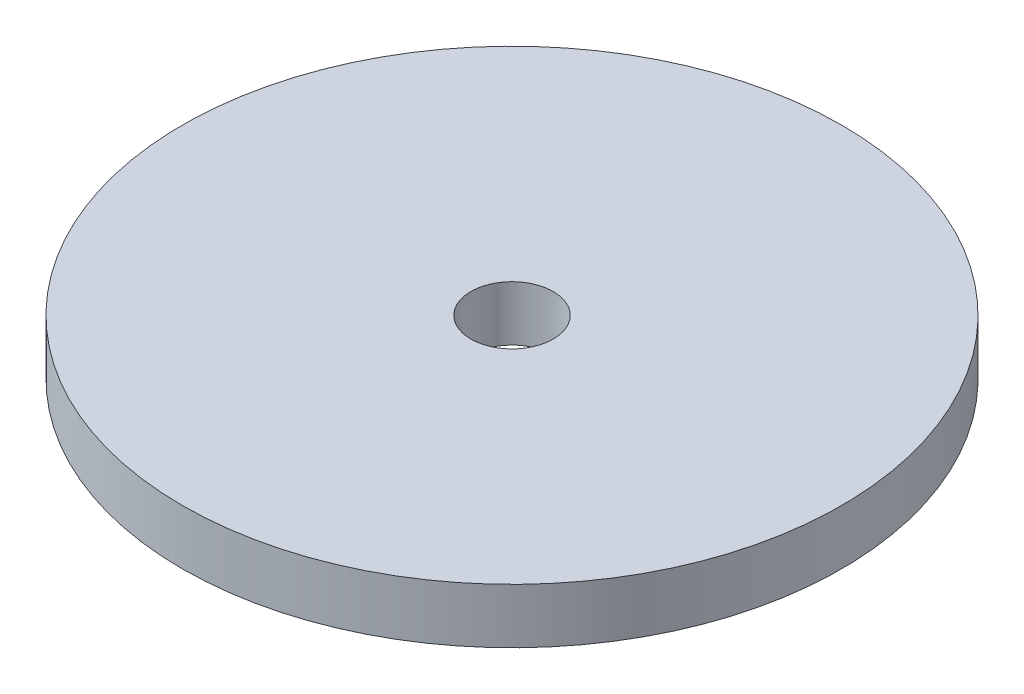
ISO-10303-21;
HEADER;
FILE_DESCRIPTION(('STEP AP214'),'2;1');
FILE_NAME('part.step','',(''),(''),'','','');
FILE_SCHEMA(('AUTOMOTIVE_DESIGN { 1 0 10303 214 1 1 1 1 }'));
ENDSEC;
DATA;
#1=APPLICATION_CONTEXT('core data for automotive mechanical design processes');
#2=APPLICATION_PROTOCOL_DEFINITION('international standard','automotive_design',2000,#1);
#3=PRODUCT_CONTEXT('',#1,'mechanical');
#4=PRODUCT('Part','Part','',(#3));
#5=PRODUCT_RELATED_PRODUCT_CATEGORY('part','',(#4));
#6=PRODUCT_DEFINITION_FORMATION('','',#4);
#7=PRODUCT_DEFINITION_CONTEXT('part definition',#1,'design');
#8=PRODUCT_DEFINITION('design','',#6,#7);
#9=PRODUCT_DEFINITION_SHAPE('','',#8);
#10=(LENGTH_UNIT() NAMED_UNIT(*) SI_UNIT(.MILLI.,.METRE.));
#11=(NAMED_UNIT(*) PLANE_ANGLE_UNIT() SI_UNIT($,.RADIAN.));
#12=(NAMED_UNIT(*) SI_UNIT($,.STERADIAN.) SOLID_ANGLE_UNIT());
#13=UNCERTAINTY_MEASURE_WITH_UNIT(LENGTH_MEASURE(1.E-05),#10,'distance_accuracy_value','');
#14=(GEOMETRIC_REPRESENTATION_CONTEXT(3) GLOBAL_UNCERTAINTY_ASSIGNED_CONTEXT((#13)) GLOBAL_UNIT_ASSIGNED_CONTEXT((#10,
#11,#12)) REPRESENTATION_CONTEXT('',''));
#15=CARTESIAN_POINT('',(0.,0.,0.));
#16=DIRECTION('',(0.,0.,1.));
#17=DIRECTION('',(1.,0.,0.));
#18=AXIS2_PLACEMENT_3D('',#15,#16,#17);
#19=CARTESIAN_POINT('',(0.,3.175,0.));
#20=DIRECTION('',(0.,1.,0.));
#21=DIRECTION('',(0.,0.,1.));
#22=AXIS2_PLACEMENT_3D('',#19,#20,#21);
#23=PLANE('',#22);
#24=CARTESIAN_POINT('',(0.,3.175,0.));
#25=DIRECTION('',(0.,1.,0.));
#26=DIRECTION('',(0.,0.,1.));
#27=AXIS2_PLACEMENT_3D('',#24,#25,#26);
#28=CIRCLE('',#27,19.05);
#29=CARTESIAN_POINT('',(0.,3.175,19.05));
#30=VERTEX_POINT('',#29);
#31=EDGE_CURVE('E11',#30,#30,#28,.T.);
#32=ORIENTED_EDGE('',*,*,#31,.T.);
#33=EDGE_LOOP('',(#32));
#34=FACE_BOUND('',#33,.T.);
#35=CARTESIAN_POINT('',(0.,3.175,0.));
#36=DIRECTION('',(0.,1.,0.));
#37=DIRECTION('',(0.,0.,1.));
#38=AXIS2_PLACEMENT_3D('',#35,#36,#37);
#39=CIRCLE('',#38,2.38125);
#40=CARTESIAN_POINT('',(0.,3.175,2.38125));
#41=VERTEX_POINT('',#40);
#42=EDGE_CURVE('E55',#41,#41,#39,.T.);
#43=ORIENTED_EDGE('',*,*,#42,.F.);
#44=EDGE_LOOP('',(#43));
#45=FACE_BOUND('',#44,.T.);
#46=ADVANCED_FACE('F42',(#34,#45),#23,.T.);
#47=CARTESIAN_POINT('',(0.,0.,0.));
#48=DIRECTION('',(0.,1.,0.));
#49=DIRECTION('',(0.,0.,1.));
#50=AXIS2_PLACEMENT_3D('',#47,#48,#49);
#51=PLANE('',#50);
#52=CARTESIAN_POINT('',(0.,0.,0.));
#53=DIRECTION('',(0.,1.,0.));
#54=DIRECTION('',(0.,0.,1.));
#55=AXIS2_PLACEMENT_3D('',#52,#53,#54);
#56=CIRCLE('',#55,19.05);
#57=CARTESIAN_POINT('',(0.,0.,19.05));
#58=VERTEX_POINT('',#57);
#59=EDGE_CURVE('E46',#58,#58,#56,.T.);
#60=ORIENTED_EDGE('',*,*,#59,.F.);
#61=EDGE_LOOP('',(#60));
#62=FACE_BOUND('',#61,.T.);
#63=CARTESIAN_POINT('',(0.,0.,0.));
#64=DIRECTION('',(0.,1.,0.));
#65=DIRECTION('',(0.,0.,1.));
#66=AXIS2_PLACEMENT_3D('',#63,#64,#65);
#67=CIRCLE('',#66,2.38125);
#68=CARTESIAN_POINT('',(0.,0.,2.38125));
#69=VERTEX_POINT('',#68);
#70=EDGE_CURVE('E58',#69,#69,#67,.T.);
#71=ORIENTED_EDGE('',*,*,#70,.T.);
#72=EDGE_LOOP('',(#71));
#73=FACE_BOUND('',#72,.T.);
#74=ADVANCED_FACE('F70',(#62,#73),#51,.F.);
#75=CARTESIAN_POINT('',(0.,3.175,0.));
#76=DIRECTION('',(0.,-1.,0.));
#77=DIRECTION('',(0.,0.,-1.));
#78=AXIS2_PLACEMENT_3D('',#75,#76,#77);
#79=CYLINDRICAL_SURFACE('',#78,19.05);
#80=ORIENTED_EDGE('',*,*,#31,.F.);
#81=EDGE_LOOP('',(#80));
#82=FACE_BOUND('',#81,.T.);
#83=ORIENTED_EDGE('',*,*,#59,.T.);
#84=EDGE_LOOP('',(#83));
#85=FACE_BOUND('',#84,.T.);
#86=ADVANCED_FACE('F44',(#82,#85),#79,.T.);
#87=CARTESIAN_POINT('',(0.,3.175,0.));
#88=DIRECTION('',(0.,-1.,0.));
#89=DIRECTION('',(0.,0.,-1.));
#90=AXIS2_PLACEMENT_3D('',#87,#88,#89);
#91=CYLINDRICAL_SURFACE('',#90,2.38125);
#92=ORIENTED_EDGE('',*,*,#42,.T.);
#93=EDGE_LOOP('',(#92));
#94=FACE_BOUND('',#93,.T.);
#95=ORIENTED_EDGE('',*,*,#70,.F.);
#96=EDGE_LOOP('',(#95));
#97=FACE_BOUND('',#96,.T.);
#98=ADVANCED_FACE('F66',(#94,#97),#91,.F.);
#99=CLOSED_SHELL('',(#46,#74,#86,#98));
#100=MANIFOLD_SOLID_BREP('B2',#99);
#101=ADVANCED_BREP_SHAPE_REPRESENTATION('',(#18,#100),#14);
#102=SHAPE_DEFINITION_REPRESENTATION(#9,#101);
ENDSEC;
END-ISO-10303-21;
